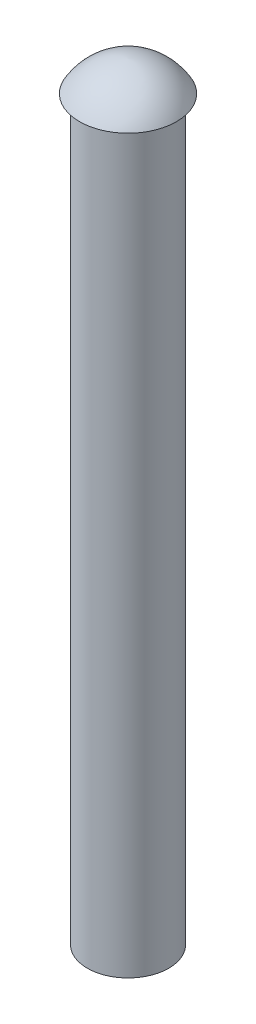
ISO-10303-21;
HEADER;
FILE_DESCRIPTION(('STEP AP214'),'2;1');
FILE_NAME('part.step','',(''),(''),'','','');
FILE_SCHEMA(('AUTOMOTIVE_DESIGN { 1 0 10303 214 1 1 1 1 }'));
ENDSEC;
DATA;
#1=APPLICATION_CONTEXT('core data for automotive mechanical design processes');
#2=APPLICATION_PROTOCOL_DEFINITION('international standard','automotive_design',2000,#1);
#3=PRODUCT_CONTEXT('',#1,'mechanical');
#4=PRODUCT('Part','Part','',(#3));
#5=PRODUCT_RELATED_PRODUCT_CATEGORY('part','',(#4));
#6=PRODUCT_DEFINITION_FORMATION('','',#4);
#7=PRODUCT_DEFINITION_CONTEXT('part definition',#1,'design');
#8=PRODUCT_DEFINITION('design','',#6,#7);
#9=PRODUCT_DEFINITION_SHAPE('','',#8);
#10=(LENGTH_UNIT() NAMED_UNIT(*) SI_UNIT(.MILLI.,.METRE.));
#11=(NAMED_UNIT(*) PLANE_ANGLE_UNIT() SI_UNIT($,.RADIAN.));
#12=(NAMED_UNIT(*) SI_UNIT($,.STERADIAN.) SOLID_ANGLE_UNIT());
#13=UNCERTAINTY_MEASURE_WITH_UNIT(LENGTH_MEASURE(1.E-05),#10,'distance_accuracy_value','');
#14=(GEOMETRIC_REPRESENTATION_CONTEXT(3) GLOBAL_UNCERTAINTY_ASSIGNED_CONTEXT((#13)) GLOBAL_UNIT_ASSIGNED_CONTEXT((#10,
#11,#12)) REPRESENTATION_CONTEXT('',''));
#15=CARTESIAN_POINT('',(0.,0.,0.));
#16=DIRECTION('',(0.,0.,1.));
#17=DIRECTION('',(1.,0.,0.));
#18=AXIS2_PLACEMENT_3D('',#15,#16,#17);
#19=CARTESIAN_POINT('',(3.61950000000001,20.4108153063574,0.));
#20=DIRECTION('',(0.,-1.,0.));
#21=DIRECTION('',(1.,0.,0.));
#22=AXIS2_PLACEMENT_3D('',#19,#20,#21);
#23=PLANE('',#22);
#24=CARTESIAN_POINT('',(0.,20.4108153063574,0.));
#25=DIRECTION('',(0.,-1.,0.));
#26=DIRECTION('',(1.,0.,0.));
#27=AXIS2_PLACEMENT_3D('',#24,#25,#26);
#28=CIRCLE('',#27,4.31800000000001);
#29=CARTESIAN_POINT('',(4.31800000000001,20.4108153063574,0.));
#30=VERTEX_POINT('',#29);
#31=EDGE_CURVE('E11',#30,#30,#28,.T.);
#32=ORIENTED_EDGE('',*,*,#31,.T.);
#33=EDGE_LOOP('',(#32));
#34=FACE_BOUND('',#33,.T.);
#35=CARTESIAN_POINT('',(0.,20.4108153063574,0.));
#36=DIRECTION('',(0.,-1.,0.));
#37=DIRECTION('',(1.,0.,0.));
#38=AXIS2_PLACEMENT_3D('',#35,#36,#37);
#39=CIRCLE('',#38,3.61950000000001);
#40=CARTESIAN_POINT('',(3.61950000000001,20.4108153063574,0.));
#41=VERTEX_POINT('',#40);
#42=EDGE_CURVE('E51',#41,#41,#39,.T.);
#43=ORIENTED_EDGE('',*,*,#42,.F.);
#44=EDGE_LOOP('',(#43));
#45=FACE_BOUND('',#44,.T.);
#46=ADVANCED_FACE('F32',(#34,#45),#23,.T.);
#47=CARTESIAN_POINT('',(-0.280313783129063,17.7959392099799,0.));
#48=DIRECTION('',(0.,0.,-1.));
#49=DIRECTION('',(1.,0.,0.));
#50=AXIS2_PLACEMENT_3D('',#47,#48,#49);
#51=CIRCLE('',#50,5.28980780818366);
#52=TRIMMED_CURVE('',#51,(PARAMETER_VALUE(-1.5177801965624)),(PARAMETER_VALUE(1.5177801965624)),
.T.,.PARAMETER.);
#53=CARTESIAN_POINT('',(0.,17.7959392099799,0.));
#54=DIRECTION('',(0.,-1.,0.));
#55=AXIS1_PLACEMENT('',#53,#54);
#56=SURFACE_OF_REVOLUTION('',#52,#55);
#57=CARTESIAN_POINT('',(0.,23.0783147012252,0.));
#58=VERTEX_POINT('',#57);
#59=VERTEX_LOOP('',#58);
#60=FACE_BOUND('',#59,.T.);
#61=ORIENTED_EDGE('',*,*,#31,.F.);
#62=EDGE_LOOP('',(#61));
#63=FACE_BOUND('',#62,.T.);
#64=ADVANCED_FACE('F41',(#60,#63),#56,.T.);
#65=CARTESIAN_POINT('',(0.,-45.1211846936426,0.));
#66=DIRECTION('',(0.,-1.,0.));
#67=DIRECTION('',(1.,0.,0.));
#68=AXIS2_PLACEMENT_3D('',#65,#66,#67);
#69=PLANE('',#68);
#70=CARTESIAN_POINT('',(0.,-45.1211846936426,0.));
#71=DIRECTION('',(0.,-1.,0.));
#72=DIRECTION('',(1.,0.,0.));
#73=AXIS2_PLACEMENT_3D('',#70,#71,#72);
#74=CIRCLE('',#73,3.6195);
#75=CARTESIAN_POINT('',(3.61950000000001,-45.1211846936426,0.));
#76=VERTEX_POINT('',#75);
#77=EDGE_CURVE('E38',#76,#76,#74,.T.);
#78=ORIENTED_EDGE('',*,*,#77,.T.);
#79=EDGE_LOOP('',(#78));
#80=FACE_BOUND('',#79,.T.);
#81=ADVANCED_FACE('F44',(#80),#69,.T.);
#82=CARTESIAN_POINT('',(0.,-45.1211846936426,0.));
#83=DIRECTION('',(0.,-1.,0.));
#84=DIRECTION('',(1.,0.,0.));
#85=AXIS2_PLACEMENT_3D('',#82,#83,#84);
#86=CYLINDRICAL_SURFACE('',#85,3.6195);
#87=ORIENTED_EDGE('',*,*,#42,.T.);
#88=EDGE_LOOP('',(#87));
#89=FACE_BOUND('',#88,.T.);
#90=ORIENTED_EDGE('',*,*,#77,.F.);
#91=EDGE_LOOP('',(#90));
#92=FACE_BOUND('',#91,.T.);
#93=ADVANCED_FACE('F58',(#89,#92),#86,.T.);
#94=CLOSED_SHELL('',(#46,#64,#81,#93));
#95=MANIFOLD_SOLID_BREP('B2',#94);
#96=ADVANCED_BREP_SHAPE_REPRESENTATION('',(#18,#95),#14);
#97=SHAPE_DEFINITION_REPRESENTATION(#9,#96);
ENDSEC;
END-ISO-10303-21;
